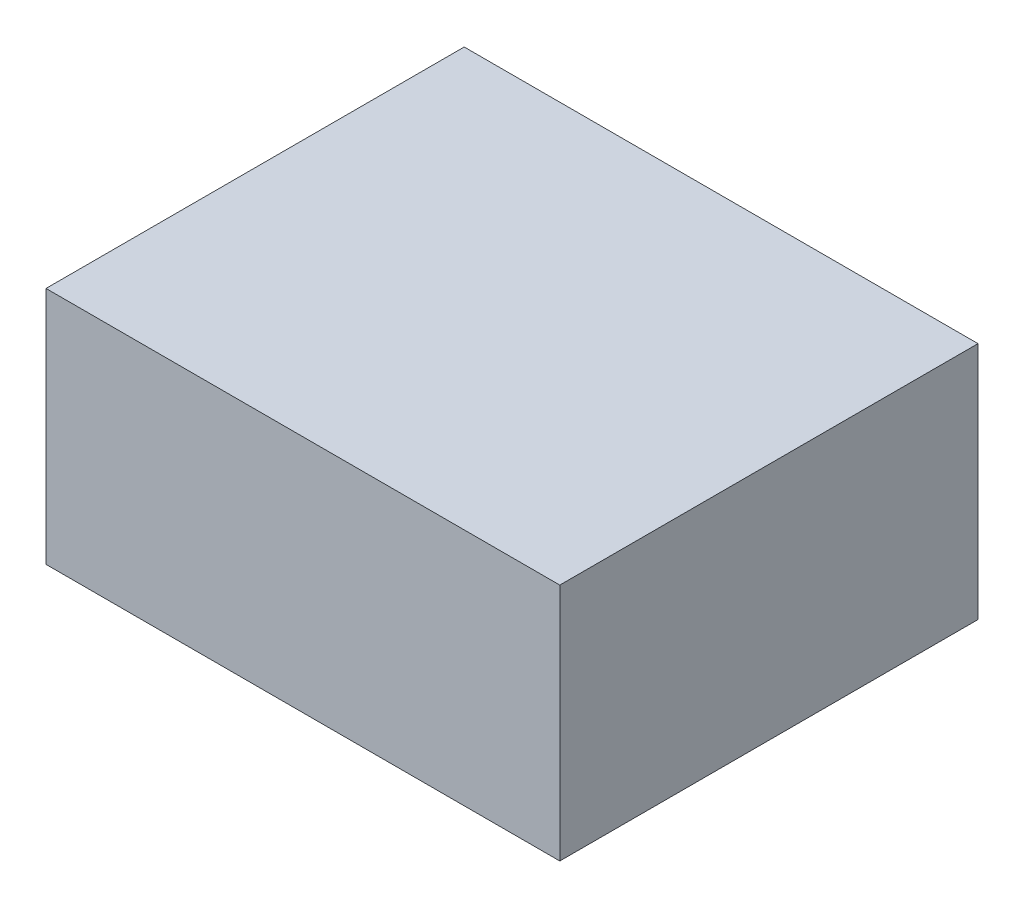
ISO-10303-21;
HEADER;
FILE_DESCRIPTION(('STEP AP214'),'2;1');
FILE_NAME('part.step','',(''),(''),'','','');
FILE_SCHEMA(('AUTOMOTIVE_DESIGN { 1 0 10303 214 1 1 1 1 }'));
ENDSEC;
DATA;
#1=APPLICATION_CONTEXT('core data for automotive mechanical design processes');
#2=APPLICATION_PROTOCOL_DEFINITION('international standard','automotive_design',2000,#1);
#3=PRODUCT_CONTEXT('',#1,'mechanical');
#4=PRODUCT('Part','Part','',(#3));
#5=PRODUCT_RELATED_PRODUCT_CATEGORY('part','',(#4));
#6=PRODUCT_DEFINITION_FORMATION('','',#4);
#7=PRODUCT_DEFINITION_CONTEXT('part definition',#1,'design');
#8=PRODUCT_DEFINITION('design','',#6,#7);
#9=PRODUCT_DEFINITION_SHAPE('','',#8);
#10=(LENGTH_UNIT() NAMED_UNIT(*) SI_UNIT(.MILLI.,.METRE.));
#11=(NAMED_UNIT(*) PLANE_ANGLE_UNIT() SI_UNIT($,.RADIAN.));
#12=(NAMED_UNIT(*) SI_UNIT($,.STERADIAN.) SOLID_ANGLE_UNIT());
#13=UNCERTAINTY_MEASURE_WITH_UNIT(LENGTH_MEASURE(1.E-05),#10,'distance_accuracy_value','');
#14=(GEOMETRIC_REPRESENTATION_CONTEXT(3) GLOBAL_UNCERTAINTY_ASSIGNED_CONTEXT((#13)) GLOBAL_UNIT_ASSIGNED_CONTEXT((#10,
#11,#12)) REPRESENTATION_CONTEXT('',''));
#15=CARTESIAN_POINT('',(0.,0.,0.));
#16=DIRECTION('',(0.,0.,1.));
#17=DIRECTION('',(1.,0.,0.));
#18=AXIS2_PLACEMENT_3D('',#15,#16,#17);
#19=CARTESIAN_POINT('',(0.,20.,0.));
#20=DIRECTION('',(1.,0.,0.));
#21=DIRECTION('',(0.,0.,-1.));
#22=AXIS2_PLACEMENT_3D('',#19,#20,#21);
#23=PLANE('',#22);
#24=DIRECTION('',(0.,0.,1.));
#25=VECTOR('',#24,1.);
#26=CARTESIAN_POINT('',(0.,0.,0.));
#27=LINE('',#26,#25);
#28=CARTESIAN_POINT('',(0.,0.,0.));
#29=VERTEX_POINT('',#28);
#30=CARTESIAN_POINT('',(0.,0.,35.));
#31=VERTEX_POINT('',#30);
#32=EDGE_CURVE('E96',#29,#31,#27,.T.);
#33=ORIENTED_EDGE('',*,*,#32,.T.);
#34=DIRECTION('',(0.,-1.,0.));
#35=VECTOR('',#34,1.);
#36=CARTESIAN_POINT('',(0.,20.,35.));
#37=LINE('',#36,#35);
#38=CARTESIAN_POINT('',(0.,20.,35.));
#39=VERTEX_POINT('',#38);
#40=EDGE_CURVE('E11',#39,#31,#37,.T.);
#41=ORIENTED_EDGE('',*,*,#40,.F.);
#42=DIRECTION('',(0.,0.,1.));
#43=VECTOR('',#42,1.);
#44=CARTESIAN_POINT('',(0.,20.,0.));
#45=LINE('',#44,#43);
#46=CARTESIAN_POINT('',(0.,20.,0.));
#47=VERTEX_POINT('',#46);
#48=EDGE_CURVE('E84',#47,#39,#45,.T.);
#49=ORIENTED_EDGE('',*,*,#48,.F.);
#50=DIRECTION('',(0.,-1.,0.));
#51=VECTOR('',#50,1.);
#52=CARTESIAN_POINT('',(0.,20.,0.));
#53=LINE('',#52,#51);
#54=EDGE_CURVE('E92',#47,#29,#53,.T.);
#55=ORIENTED_EDGE('',*,*,#54,.T.);
#56=EDGE_LOOP('',(#33,#41,#49,#55));
#57=FACE_BOUND('',#56,.T.);
#58=ADVANCED_FACE('F33',(#57),#23,.F.);
#59=CARTESIAN_POINT('',(0.,20.,35.));
#60=DIRECTION('',(0.,0.,-1.));
#61=DIRECTION('',(-1.,0.,0.));
#62=AXIS2_PLACEMENT_3D('',#59,#60,#61);
#63=PLANE('',#62);
#64=DIRECTION('',(1.,0.,0.));
#65=VECTOR('',#64,1.);
#66=CARTESIAN_POINT('',(0.,0.,35.));
#67=LINE('',#66,#65);
#68=CARTESIAN_POINT('',(43.,0.,35.));
#69=VERTEX_POINT('',#68);
#70=EDGE_CURVE('E88',#31,#69,#67,.T.);
#71=ORIENTED_EDGE('',*,*,#70,.T.);
#72=DIRECTION('',(0.,-1.,0.));
#73=VECTOR('',#72,1.);
#74=CARTESIAN_POINT('',(43.,20.,35.));
#75=LINE('',#74,#73);
#76=CARTESIAN_POINT('',(43.,20.,35.));
#77=VERTEX_POINT('',#76);
#78=EDGE_CURVE('E41',#77,#69,#75,.T.);
#79=ORIENTED_EDGE('',*,*,#78,.F.);
#80=DIRECTION('',(1.,0.,0.));
#81=VECTOR('',#80,1.);
#82=CARTESIAN_POINT('',(0.,20.,35.));
#83=LINE('',#82,#81);
#84=EDGE_CURVE('E79',#39,#77,#83,.T.);
#85=ORIENTED_EDGE('',*,*,#84,.F.);
#86=ORIENTED_EDGE('',*,*,#40,.T.);
#87=EDGE_LOOP('',(#71,#79,#85,#86));
#88=FACE_BOUND('',#87,.T.);
#89=ADVANCED_FACE('F87',(#88),#63,.F.);
#90=CARTESIAN_POINT('',(43.,20.,0.));
#91=DIRECTION('',(-1.,0.,0.));
#92=DIRECTION('',(0.,0.,1.));
#93=AXIS2_PLACEMENT_3D('',#90,#91,#92);
#94=PLANE('',#93);
#95=DIRECTION('',(0.,0.,-1.));
#96=VECTOR('',#95,1.);
#97=CARTESIAN_POINT('',(43.,0.,0.));
#98=LINE('',#97,#96);
#99=CARTESIAN_POINT('',(43.,0.,0.));
#100=VERTEX_POINT('',#99);
#101=EDGE_CURVE('E66',#69,#100,#98,.T.);
#102=ORIENTED_EDGE('',*,*,#101,.T.);
#103=DIRECTION('',(0.,-1.,0.));
#104=VECTOR('',#103,1.);
#105=CARTESIAN_POINT('',(43.,20.,0.));
#106=LINE('',#105,#104);
#107=CARTESIAN_POINT('',(43.,20.,0.));
#108=VERTEX_POINT('',#107);
#109=EDGE_CURVE('E89',#108,#100,#106,.T.);
#110=ORIENTED_EDGE('',*,*,#109,.F.);
#111=DIRECTION('',(0.,0.,-1.));
#112=VECTOR('',#111,1.);
#113=CARTESIAN_POINT('',(43.,20.,0.));
#114=LINE('',#113,#112);
#115=EDGE_CURVE('E82',#77,#108,#114,.T.);
#116=ORIENTED_EDGE('',*,*,#115,.F.);
#117=ORIENTED_EDGE('',*,*,#78,.T.);
#118=EDGE_LOOP('',(#102,#110,#116,#117));
#119=FACE_BOUND('',#118,.T.);
#120=ADVANCED_FACE('F90',(#119),#94,.F.);
#121=CARTESIAN_POINT('',(0.,20.,0.));
#122=DIRECTION('',(0.,0.,1.));
#123=DIRECTION('',(1.,0.,0.));
#124=AXIS2_PLACEMENT_3D('',#121,#122,#123);
#125=PLANE('',#124);
#126=DIRECTION('',(-1.,0.,0.));
#127=VECTOR('',#126,1.);
#128=CARTESIAN_POINT('',(0.,0.,0.));
#129=LINE('',#128,#127);
#130=EDGE_CURVE('E72',#100,#29,#129,.T.);
#131=ORIENTED_EDGE('',*,*,#130,.T.);
#132=ORIENTED_EDGE('',*,*,#54,.F.);
#133=DIRECTION('',(-1.,0.,0.));
#134=VECTOR('',#133,1.);
#135=CARTESIAN_POINT('',(0.,20.,0.));
#136=LINE('',#135,#134);
#137=EDGE_CURVE('E49',#108,#47,#136,.T.);
#138=ORIENTED_EDGE('',*,*,#137,.F.);
#139=ORIENTED_EDGE('',*,*,#109,.T.);
#140=EDGE_LOOP('',(#131,#132,#138,#139));
#141=FACE_BOUND('',#140,.T.);
#142=ADVANCED_FACE('F103',(#141),#125,.F.);
#143=CARTESIAN_POINT('',(0.,20.,0.));
#144=DIRECTION('',(0.,1.,0.));
#145=DIRECTION('',(0.,0.,1.));
#146=AXIS2_PLACEMENT_3D('',#143,#144,#145);
#147=PLANE('',#146);
#148=ORIENTED_EDGE('',*,*,#48,.T.);
#149=ORIENTED_EDGE('',*,*,#84,.T.);
#150=ORIENTED_EDGE('',*,*,#115,.T.);
#151=ORIENTED_EDGE('',*,*,#137,.T.);
#152=EDGE_LOOP('',(#148,#149,#150,#151));
#153=FACE_BOUND('',#152,.T.);
#154=ADVANCED_FACE('F80',(#153),#147,.T.);
#155=CARTESIAN_POINT('',(0.,0.,0.));
#156=DIRECTION('',(0.,1.,0.));
#157=DIRECTION('',(0.,0.,1.));
#158=AXIS2_PLACEMENT_3D('',#155,#156,#157);
#159=PLANE('',#158);
#160=ORIENTED_EDGE('',*,*,#32,.F.);
#161=ORIENTED_EDGE('',*,*,#130,.F.);
#162=ORIENTED_EDGE('',*,*,#101,.F.);
#163=ORIENTED_EDGE('',*,*,#70,.F.);
#164=EDGE_LOOP('',(#160,#161,#162,#163));
#165=FACE_BOUND('',#164,.T.);
#166=ADVANCED_FACE('F106',(#165),#159,.F.);
#167=CLOSED_SHELL('',(#58,#89,#120,#142,#154,#166));
#168=MANIFOLD_SOLID_BREP('B2',#167);
#169=ADVANCED_BREP_SHAPE_REPRESENTATION('',(#18,#168),#14);
#170=SHAPE_DEFINITION_REPRESENTATION(#9,#169);
ENDSEC;
END-ISO-10303-21;
